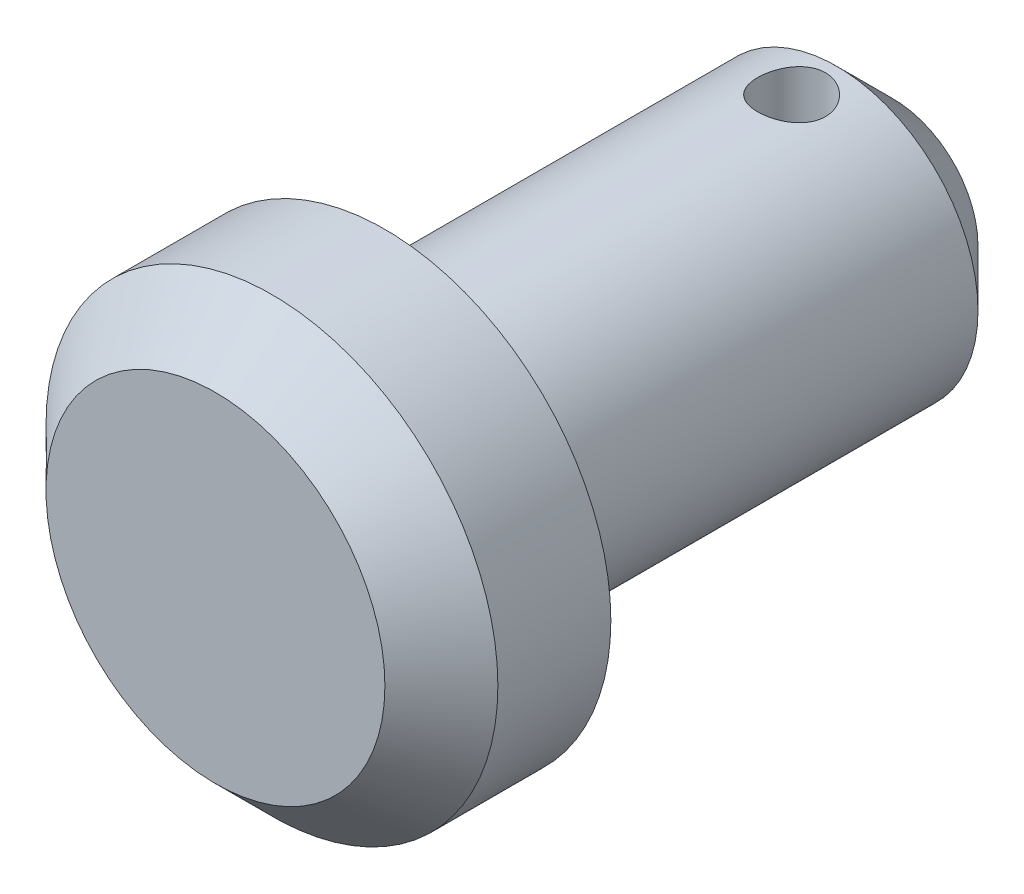
ISO-10303-21;
HEADER;
FILE_DESCRIPTION(('STEP AP214'),'2;1');
FILE_NAME('part.step','',(''),(''),'','','');
FILE_SCHEMA(('AUTOMOTIVE_DESIGN { 1 0 10303 214 1 1 1 1 }'));
ENDSEC;
DATA;
#1=APPLICATION_CONTEXT('core data for automotive mechanical design processes');
#2=APPLICATION_PROTOCOL_DEFINITION('international standard','automotive_design',2000,#1);
#3=PRODUCT_CONTEXT('',#1,'mechanical');
#4=PRODUCT('Part','Part','',(#3));
#5=PRODUCT_RELATED_PRODUCT_CATEGORY('part','',(#4));
#6=PRODUCT_DEFINITION_FORMATION('','',#4);
#7=PRODUCT_DEFINITION_CONTEXT('part definition',#1,'design');
#8=PRODUCT_DEFINITION('design','',#6,#7);
#9=PRODUCT_DEFINITION_SHAPE('','',#8);
#10=(LENGTH_UNIT() NAMED_UNIT(*) SI_UNIT(.MILLI.,.METRE.));
#11=(NAMED_UNIT(*) PLANE_ANGLE_UNIT() SI_UNIT($,.RADIAN.));
#12=(NAMED_UNIT(*) SI_UNIT($,.STERADIAN.) SOLID_ANGLE_UNIT());
#13=UNCERTAINTY_MEASURE_WITH_UNIT(LENGTH_MEASURE(1.E-05),#10,'distance_accuracy_value','');
#14=(GEOMETRIC_REPRESENTATION_CONTEXT(3) GLOBAL_UNCERTAINTY_ASSIGNED_CONTEXT((#13)) GLOBAL_UNIT_ASSIGNED_CONTEXT((#10,
#11,#12)) REPRESENTATION_CONTEXT('',''));
#15=CARTESIAN_POINT('',(0.,0.,0.));
#16=DIRECTION('',(0.,0.,1.));
#17=DIRECTION('',(1.,0.,0.));
#18=AXIS2_PLACEMENT_3D('',#15,#16,#17);
#19=CARTESIAN_POINT('',(0.,0.,0.));
#20=DIRECTION('',(0.,0.,-1.));
#21=DIRECTION('',(-1.,0.,0.));
#22=AXIS2_PLACEMENT_3D('',#19,#20,#21);
#23=PLANE('',#22);
#24=CARTESIAN_POINT('',(0.,0.,0.));
#25=DIRECTION('',(0.,0.,1.));
#26=DIRECTION('',(1.,0.,0.));
#27=AXIS2_PLACEMENT_3D('',#24,#25,#26);
#28=CIRCLE('',#27,30.);
#29=CARTESIAN_POINT('',(30.,0.,0.));
#30=VERTEX_POINT('',#29);
#31=EDGE_CURVE('E10',#30,#30,#28,.T.);
#32=ORIENTED_EDGE('',*,*,#31,.T.);
#33=EDGE_LOOP('',(#32));
#34=FACE_BOUND('',#33,.T.);
#35=ADVANCED_FACE('F37',(#34),#23,.F.);
#36=CARTESIAN_POINT('',(0.,0.,-9.99999999999996));
#37=DIRECTION('',(0.,0.,-1.));
#38=DIRECTION('',(-1.,0.,0.));
#39=AXIS2_PLACEMENT_3D('',#36,#37,#38);
#40=CONICAL_SURFACE('',#39,40.,0.78539816339745);
#41=ORIENTED_EDGE('',*,*,#31,.F.);
#42=EDGE_LOOP('',(#41));
#43=FACE_BOUND('',#42,.T.);
#44=CARTESIAN_POINT('',(0.,0.,-9.99999999999996));
#45=DIRECTION('',(0.,0.,1.));
#46=DIRECTION('',(1.,0.,0.));
#47=AXIS2_PLACEMENT_3D('',#44,#45,#46);
#48=CIRCLE('',#47,40.);
#49=CARTESIAN_POINT('',(40.,0.,-9.99999999999996));
#50=VERTEX_POINT('',#49);
#51=EDGE_CURVE('E50',#50,#50,#48,.T.);
#52=ORIENTED_EDGE('',*,*,#51,.T.);
#53=EDGE_LOOP('',(#52));
#54=FACE_BOUND('',#53,.T.);
#55=ADVANCED_FACE('F89',(#43,#54),#40,.T.);
#56=CARTESIAN_POINT('',(0.,0.,0.));
#57=DIRECTION('',(0.,0.,1.));
#58=DIRECTION('',(1.,0.,0.));
#59=AXIS2_PLACEMENT_3D('',#56,#57,#58);
#60=CYLINDRICAL_SURFACE('',#59,40.);
#61=ORIENTED_EDGE('',*,*,#51,.F.);
#62=EDGE_LOOP('',(#61));
#63=FACE_BOUND('',#62,.T.);
#64=CARTESIAN_POINT('',(0.,0.,-30.));
#65=DIRECTION('',(0.,0.,1.));
#66=DIRECTION('',(1.,0.,0.));
#67=AXIS2_PLACEMENT_3D('',#64,#65,#66);
#68=CIRCLE('',#67,40.);
#69=CARTESIAN_POINT('',(40.,0.,-30.));
#70=VERTEX_POINT('',#69);
#71=EDGE_CURVE('E56',#70,#70,#68,.T.);
#72=ORIENTED_EDGE('',*,*,#71,.T.);
#73=EDGE_LOOP('',(#72));
#74=FACE_BOUND('',#73,.T.);
#75=ADVANCED_FACE('F93',(#63,#74),#60,.T.);
#76=CARTESIAN_POINT('',(0.,40.,-30.));
#77=DIRECTION('',(0.,0.,1.));
#78=DIRECTION('',(1.,0.,0.));
#79=AXIS2_PLACEMENT_3D('',#76,#77,#78);
#80=PLANE('',#79);
#81=ORIENTED_EDGE('',*,*,#71,.F.);
#82=EDGE_LOOP('',(#81));
#83=FACE_BOUND('',#82,.T.);
#84=CARTESIAN_POINT('',(0.,0.,-30.));
#85=DIRECTION('',(0.,0.,1.));
#86=DIRECTION('',(1.,0.,0.));
#87=AXIS2_PLACEMENT_3D('',#84,#85,#86);
#88=CIRCLE('',#87,25.);
#89=CARTESIAN_POINT('',(25.,0.,-30.));
#90=VERTEX_POINT('',#89);
#91=EDGE_CURVE('E110',#90,#90,#88,.T.);
#92=ORIENTED_EDGE('',*,*,#91,.T.);
#93=EDGE_LOOP('',(#92));
#94=FACE_BOUND('',#93,.T.);
#95=ADVANCED_FACE('F84',(#83,#94),#80,.F.);
#96=CARTESIAN_POINT('',(0.,0.,0.));
#97=DIRECTION('',(0.,0.,1.));
#98=DIRECTION('',(1.,0.,0.));
#99=AXIS2_PLACEMENT_3D('',#96,#97,#98);
#100=CYLINDRICAL_SURFACE('',#99,25.);
#101=CARTESIAN_POINT('',(0.,-25.,-96.));
#102=CARTESIAN_POINT('',(0.166017736340744,-25.0000026804997,-95.9999954345979));
#103=CARTESIAN_POINT('',(0.331984064130571,-24.9983437383731,-96.0068916684901));
#104=CARTESIAN_POINT('',(0.662757375273784,-24.9917601768854,-96.0344090099474));
#105=CARTESIAN_POINT('',(0.827564209779563,-24.9868351457074,-96.0550318482831));
#106=CARTESIAN_POINT('',(1.15483168687375,-24.9738504635424,-96.1098464151674));
#107=CARTESIAN_POINT('',(1.31729147606247,-24.9657897007271,-96.144042956597));
#108=CARTESIAN_POINT('',(1.63872050759381,-24.9467537443302,-96.2257380792299));
#109=CARTESIAN_POINT('',(1.79768844089951,-24.9357774773038,-96.2732415602008));
#110=CARTESIAN_POINT('',(2.11072366381165,-24.9112316091515,-96.3810845999628));
#111=CARTESIAN_POINT('',(2.26479812859839,-24.897666030887,-96.4414042632373));
#112=CARTESIAN_POINT('',(2.56731972417305,-24.8682925860487,-96.5744873495995));
#113=CARTESIAN_POINT('',(2.71576475309531,-24.8524838922068,-96.6472553657249));
#114=CARTESIAN_POINT('',(3.00593509691774,-24.8190587739081,-96.8046570905517));
#115=CARTESIAN_POINT('',(3.14766294672407,-24.8014430394569,-96.8892862746391));
#116=CARTESIAN_POINT('',(3.42359889441686,-24.7648612187919,-97.069871239809));
#117=CARTESIAN_POINT('',(3.55780414185136,-24.7458946268123,-97.1658312721407));
#118=CARTESIAN_POINT('',(3.81996752921303,-24.7067947855154,-97.3701054995632));
#119=CARTESIAN_POINT('',(3.94778319107672,-24.6866473068088,-97.4785998623137));
#120=CARTESIAN_POINT('',(4.19391043753479,-24.6460277155742,-97.7059123541216));
#121=CARTESIAN_POINT('',(4.31221847908384,-24.6255554853983,-97.8247342977654));
#122=CARTESIAN_POINT('',(4.53846894982133,-24.5848634527513,-98.0718508641517));
#123=CARTESIAN_POINT('',(4.64641408237687,-24.5646435856504,-98.2001430008769));
#124=CARTESIAN_POINT('',(4.85128465634762,-24.5250062264423,-98.4654368671125));
#125=CARTESIAN_POINT('',(4.94820601608992,-24.5055890332168,-98.6024417935444));
#126=CARTESIAN_POINT('',(5.1315149308875,-24.4678652790419,-98.8860890587549));
#127=CARTESIAN_POINT('',(5.21774615640803,-24.4495768107614,-99.0328349214476));
#128=CARTESIAN_POINT('',(5.37754406139993,-24.4149279468241,-99.3333541827147));
#129=CARTESIAN_POINT('',(5.45110595933349,-24.3985682798489,-99.4871302069595));
#130=CARTESIAN_POINT('',(5.58492026214268,-24.3682865029779,-99.8005322339703));
#131=CARTESIAN_POINT('',(5.64517912327471,-24.354363211339,-99.9601553549607));
#132=CARTESIAN_POINT('',(5.75195806967359,-24.3293636773731,-100.284147125475));
#133=CARTESIAN_POINT('',(5.79847322039683,-24.318288457803,-100.448517456241));
#134=CARTESIAN_POINT('',(5.91523377010968,-24.2902598679583,-100.940800804161));
#135=CARTESIAN_POINT('',(5.96534620186163,-24.2778811042379,-101.274125250886));
#136=CARTESIAN_POINT('',(5.99819895021148,-24.2697663322526,-101.776475601756));
#137=CARTESIAN_POINT('',(6.00209048242323,-24.2688053008257,-101.944385487369));
#138=CARTESIAN_POINT('',(5.99581246294926,-24.2703574949624,-102.279946661259));
#139=CARTESIAN_POINT('',(5.98564275494965,-24.2728707591485,-102.447597946641));
#140=CARTESIAN_POINT('',(5.93483975630033,-24.285368999466,-102.940764562036));
#141=CARTESIAN_POINT('',(5.87440247397774,-24.3001939850224,-103.26433890737));
#142=CARTESIAN_POINT('',(5.70184242669472,-24.3412549446464,-103.896444859761));
#143=CARTESIAN_POINT('',(5.58971623816143,-24.3674916745551,-104.204975468911));
#144=CARTESIAN_POINT('',(5.31588253494411,-24.4286958367201,-104.801812311694));
#145=CARTESIAN_POINT('',(5.15371899452585,-24.4637429965247,-105.089901246387));
#146=CARTESIAN_POINT('',(4.78473374953622,-24.5385748778448,-105.635212661486));
#147=CARTESIAN_POINT('',(4.57790479882187,-24.5783603675971,-105.892430123017));
#148=CARTESIAN_POINT('',(4.11902988641843,-24.6594640880418,-106.375786122191));
#149=CARTESIAN_POINT('',(3.86594129003373,-24.7007951674045,-106.6009339253));
#150=CARTESIAN_POINT('',(3.32511184695824,-24.7793903091839,-107.005769712324));
#151=CARTESIAN_POINT('',(3.0373700989422,-24.8166542657671,-107.185456513426));
#152=CARTESIAN_POINT('',(2.43405695507432,-24.8830789940348,-107.494594368169));
#153=CARTESIAN_POINT('',(2.11840557448716,-24.9122154123614,-107.623894894268));
#154=CARTESIAN_POINT('',(1.46899521159138,-24.9589240940734,-107.827330176301));
#155=CARTESIAN_POINT('',(1.13523942521409,-24.9764983913503,-107.901474635033));
#156=CARTESIAN_POINT('',(0.467574800827581,-24.9978055089126,-107.99100412952));
#157=CARTESIAN_POINT('',(0.133856966575303,-25.0018564268946,-108.007739803127));
#158=CARTESIAN_POINT('',(-0.531608768658081,-24.9965614831509,-107.985666448096));
#159=CARTESIAN_POINT('',(-0.863356829944314,-24.9872167270307,-107.946862003436));
#160=CARTESIAN_POINT('',(-1.51084514007901,-24.9563832816127,-107.815926114576));
#161=CARTESIAN_POINT('',(-1.8267410839496,-24.9350603275565,-107.724522047641));
#162=CARTESIAN_POINT('',(-2.4387066749497,-24.8826669936479,-107.491803349796));
#163=CARTESIAN_POINT('',(-2.73477441187555,-24.8515956762951,-107.350483918359));
#164=CARTESIAN_POINT('',(-3.30412273668564,-24.7823820658762,-107.019267825048));
#165=CARTESIAN_POINT('',(-3.57694246966834,-24.7441307708391,-106.828602373031));
#166=CARTESIAN_POINT('',(-4.08719914724013,-24.6649871461435,-106.40508233449));
#167=CARTESIAN_POINT('',(-4.32463047973872,-24.6240943990595,-106.172221069265));
#168=CARTESIAN_POINT('',(-4.76284500809665,-24.5431489449983,-105.664732875858));
#169=CARTESIAN_POINT('',(-4.96268414096836,-24.5031358001301,-105.389284582089));
#170=CARTESIAN_POINT('',(-5.31333575577366,-24.4295058119813,-104.807764320409));
#171=CARTESIAN_POINT('',(-5.46415043292341,-24.395888682328,-104.501693724506));
#172=CARTESIAN_POINT('',(-5.64963439053452,-24.353347630646,-104.027406316014));
#173=CARTESIAN_POINT('',(-5.70458710242878,-24.3405033891164,-103.867193043385));
#174=CARTESIAN_POINT('',(-5.80079732294279,-24.3177552029261,-103.542517979968));
#175=CARTESIAN_POINT('',(-5.84205998439172,-24.3078501521252,-103.378057812857));
#176=CARTESIAN_POINT('',(-5.91053741786634,-24.2912903166139,-103.046082096771));
#177=CARTESIAN_POINT('',(-5.93775173433045,-24.2846356373073,-102.878566448895));
#178=CARTESIAN_POINT('',(-5.97789965204539,-24.2747841701866,-102.541733533145));
#179=CARTESIAN_POINT('',(-5.99083389159896,-24.2715872278157,-102.372416346139));
#180=CARTESIAN_POINT('',(-6.00215499594079,-24.2687899616173,-102.037751269488));
#181=CARTESIAN_POINT('',(-6.00091722515411,-24.2690968340135,-101.872416715526));
#182=CARTESIAN_POINT('',(-5.98480872784869,-24.2730742483489,-101.542456478065));
#183=CARTESIAN_POINT('',(-5.969938298505,-24.2767447169658,-101.377830779192));
#184=CARTESIAN_POINT('',(-5.92668661056588,-24.2873399112073,-101.050445398434));
#185=CARTESIAN_POINT('',(-5.89830323162515,-24.294265147542,-100.887686013502));
#186=CARTESIAN_POINT('',(-5.82827196779404,-24.3111608262961,-100.565269798519));
#187=CARTESIAN_POINT('',(-5.78662876790753,-24.3211301931022,-100.40561189375));
#188=CARTESIAN_POINT('',(-5.69063662986335,-24.3437686465433,-100.091192481029));
#189=CARTESIAN_POINT('',(-5.63634876916799,-24.3564247302984,-99.9364113728174));
#190=CARTESIAN_POINT('',(-5.51539707483436,-24.3840980883562,-99.6320466118608));
#191=CARTESIAN_POINT('',(-5.44873755154826,-24.3991145400161,-99.4824611704006));
#192=CARTESIAN_POINT('',(-5.30348427217981,-24.4310987091682,-99.1893378330844));
#193=CARTESIAN_POINT('',(-5.22488523075193,-24.4480672900111,-99.0458026516644));
#194=CARTESIAN_POINT('',(-5.05635243091258,-24.4834782828489,-98.7658088548311));
#195=CARTESIAN_POINT('',(-4.96642242689348,-24.5019202059306,-98.6293479164855));
#196=CARTESIAN_POINT('',(-4.77346921711415,-24.5402505889388,-98.3610496167077));
#197=CARTESIAN_POINT('',(-4.67017903544834,-24.5601634300574,-98.2294076688703));
#198=CARTESIAN_POINT('',(-4.45304880482869,-24.600458146359,-97.97529158151));
#199=CARTESIAN_POINT('',(-4.33921237965749,-24.6208398586377,-97.8528143188772));
#200=CARTESIAN_POINT('',(-4.10164015488732,-24.661530300392,-97.6177068870181));
#201=CARTESIAN_POINT('',(-3.97789855094998,-24.6818389796797,-97.5050825736226));
#202=CARTESIAN_POINT('',(-3.7214296777047,-24.7218081005976,-97.2905518952424));
#203=CARTESIAN_POINT('',(-3.58870570477298,-24.7414687761375,-97.1886416330669));
#204=CARTESIAN_POINT('',(-3.31280088827595,-24.7799327781137,-96.9945760775045));
#205=CARTESIAN_POINT('',(-3.16948213881107,-24.7987162302532,-96.9026127516375));
#206=CARTESIAN_POINT('',(-2.8754381763477,-24.8345280560803,-96.7311469277116));
#207=CARTESIAN_POINT('',(-2.72471571591034,-24.8515570748485,-96.6516398440273));
#208=CARTESIAN_POINT('',(-2.41692354679156,-24.883375777664,-96.5056877128525));
#209=CARTESIAN_POINT('',(-2.25985686316147,-24.8981665133663,-96.4392365266561));
#210=CARTESIAN_POINT('',(-1.94048744711081,-24.9250921884147,-96.3198957279609));
#211=CARTESIAN_POINT('',(-1.77818555787967,-24.9372275530119,-96.2670039437237));
#212=CARTESIAN_POINT('',(-1.35190448336008,-24.9647957983314,-96.1479748265459));
#213=CARTESIAN_POINT('',(-1.08469226075994,-24.9779181465939,-96.0925758515092));
#214=CARTESIAN_POINT('',(-0.544940331071901,-24.9955177731159,-96.0185933557941));
#215=CARTESIAN_POINT('',(-0.272400964328515,-24.9999956018512,-96.000007490886));
#216=CARTESIAN_POINT('',(0.,-25.,-96.));
#217=B_SPLINE_CURVE_WITH_KNOTS('',3,(#101,#102,#103,#104,#105,#106,#107,#108,#109,#110,#111,
#112,#113,#114,#115,#116,#117,#118,#119,#120,#121,#122,#123,#124,#125,#126,#127,#128,#129,#130,
#131,#132,#133,#134,#135,#136,#137,#138,#139,#140,#141,#142,#143,#144,#145,#146,#147,#148,#149,
#150,#151,#152,#153,#154,#155,#156,#157,#158,#159,#160,#161,#162,#163,#164,#165,#166,#167,#168,
#169,#170,#171,#172,#173,#174,#175,#176,#177,#178,#179,#180,#181,#182,#183,#184,#185,#186,#187,
#188,#189,#190,#191,#192,#193,#194,#195,#196,#197,#198,#199,#200,#201,#202,#203,#204,#205,#206,
#207,#208,#209,#210,#211,#212,#213,#214,#215,#216),.UNSPECIFIED.,.T.,.F.,(4,2,2,2,2,2,2,2,2,2,2,
2,2,2,2,2,2,2,2,2,2,2,2,2,2,2,2,2,2,2,2,2,2,2,2,2,2,2,2,2,2,2,2,2,2,2,2,2,2,2,2,2,2,2,2,2,2,4),
(0.,0.497813360100954,0.995689500769747,1.49374233325073,1.99197879609469,2.4894473877073,
2.98709992652942,3.4845631426913,3.98221359994715,4.48820831908742,4.99439073274951,
5.50044073797176,6.00667750796929,6.5196119014362,7.03273945954076,7.54561743540079,
8.05867933189508,9.06463756237654,9.56800871792682,10.0713854693234,11.0548629550302,
12.0384055899336,13.0311908061742,14.0241372047509,15.0430966233895,16.0620825507942,
17.0840897493149,18.1059171185591,19.1035329919673,20.1010665323702,21.085126203147,
22.069280539993,23.0698021185097,24.0704821968969,25.0936623603892,26.1167967016263,
26.6258643414059,27.1347401541084,27.6436324676663,28.1525020334114,28.6479253897995,
29.1433379468293,29.6388282657176,30.1341437102249,30.6271145113295,31.1199138801487,
31.6129320389054,32.105787268885,32.6107272666003,33.1154944014541,33.6205595212516,
34.1254402854413,34.6387770201077,35.1519243293048,35.6648297831432,36.1776530362049,
36.9945144051894,37.8113237554193),.UNSPECIFIED.);
#218=CARTESIAN_POINT('',(0.,-25.,-96.));
#219=VERTEX_POINT('',#218);
#220=EDGE_CURVE('E40',#219,#219,#217,.T.);
#221=ORIENTED_EDGE('',*,*,#220,.T.);
#222=EDGE_LOOP('',(#221));
#223=FACE_BOUND('',#222,.T.);
#224=CARTESIAN_POINT('',(0.,25.,-96.));
#225=CARTESIAN_POINT('',(-0.166017736340744,25.0000026804997,-95.9999954345979));
#226=CARTESIAN_POINT('',(-0.331984064130571,24.9983437383731,-96.0068916684901));
#227=CARTESIAN_POINT('',(-0.662757375273784,24.9917601768854,-96.0344090099474));
#228=CARTESIAN_POINT('',(-0.827564209779563,24.9868351457074,-96.0550318482831));
#229=CARTESIAN_POINT('',(-1.15483168687375,24.9738504635424,-96.1098464151674));
#230=CARTESIAN_POINT('',(-1.31729147606247,24.9657897007271,-96.144042956597));
#231=CARTESIAN_POINT('',(-1.63872050759381,24.9467537443302,-96.2257380792299));
#232=CARTESIAN_POINT('',(-1.79768844089951,24.9357774773038,-96.2732415602008));
#233=CARTESIAN_POINT('',(-2.11072366381165,24.9112316091515,-96.3810845999628));
#234=CARTESIAN_POINT('',(-2.26479812859839,24.897666030887,-96.4414042632373));
#235=CARTESIAN_POINT('',(-2.56731972417305,24.8682925860487,-96.5744873495995));
#236=CARTESIAN_POINT('',(-2.71576475309531,24.8524838922068,-96.6472553657249));
#237=CARTESIAN_POINT('',(-3.00593509691774,24.8190587739081,-96.8046570905517));
#238=CARTESIAN_POINT('',(-3.14766294672407,24.8014430394569,-96.8892862746391));
#239=CARTESIAN_POINT('',(-3.42359889441686,24.7648612187919,-97.069871239809));
#240=CARTESIAN_POINT('',(-3.55780414185136,24.7458946268123,-97.1658312721407));
#241=CARTESIAN_POINT('',(-3.81996752921303,24.7067947855154,-97.3701054995632));
#242=CARTESIAN_POINT('',(-3.94778319107672,24.6866473068088,-97.4785998623137));
#243=CARTESIAN_POINT('',(-4.19391043753479,24.6460277155742,-97.7059123541216));
#244=CARTESIAN_POINT('',(-4.31221847908384,24.6255554853983,-97.8247342977654));
#245=CARTESIAN_POINT('',(-4.53846894982133,24.5848634527513,-98.0718508641517));
#246=CARTESIAN_POINT('',(-4.64641408237687,24.5646435856504,-98.2001430008769));
#247=CARTESIAN_POINT('',(-4.85128465634762,24.5250062264423,-98.4654368671125));
#248=CARTESIAN_POINT('',(-4.94820601608992,24.5055890332168,-98.6024417935444));
#249=CARTESIAN_POINT('',(-5.1315149308875,24.4678652790419,-98.8860890587549));
#250=CARTESIAN_POINT('',(-5.21774615640803,24.4495768107614,-99.0328349214476));
#251=CARTESIAN_POINT('',(-5.37754406139993,24.4149279468241,-99.3333541827147));
#252=CARTESIAN_POINT('',(-5.45110595933349,24.3985682798489,-99.4871302069595));
#253=CARTESIAN_POINT('',(-5.58492026214268,24.3682865029779,-99.8005322339703));
#254=CARTESIAN_POINT('',(-5.64517912327471,24.354363211339,-99.9601553549607));
#255=CARTESIAN_POINT('',(-5.75195806967359,24.3293636773731,-100.284147125475));
#256=CARTESIAN_POINT('',(-5.79847322039683,24.318288457803,-100.448517456241));
#257=CARTESIAN_POINT('',(-5.91523377010968,24.2902598679583,-100.940800804161));
#258=CARTESIAN_POINT('',(-5.96534620186163,24.2778811042379,-101.274125250886));
#259=CARTESIAN_POINT('',(-5.99819895021148,24.2697663322526,-101.776475601756));
#260=CARTESIAN_POINT('',(-6.00209048242323,24.2688053008257,-101.944385487369));
#261=CARTESIAN_POINT('',(-5.99581246294926,24.2703574949624,-102.279946661259));
#262=CARTESIAN_POINT('',(-5.98564275494965,24.2728707591485,-102.447597946641));
#263=CARTESIAN_POINT('',(-5.93483975630033,24.285368999466,-102.940764562036));
#264=CARTESIAN_POINT('',(-5.87440247397774,24.3001939850224,-103.26433890737));
#265=CARTESIAN_POINT('',(-5.70184242669472,24.3412549446464,-103.896444859761));
#266=CARTESIAN_POINT('',(-5.58971623816143,24.3674916745551,-104.204975468911));
#267=CARTESIAN_POINT('',(-5.31588253494411,24.4286958367201,-104.801812311694));
#268=CARTESIAN_POINT('',(-5.15371899452585,24.4637429965247,-105.089901246387));
#269=CARTESIAN_POINT('',(-4.78473374953622,24.5385748778448,-105.635212661486));
#270=CARTESIAN_POINT('',(-4.57790479882187,24.5783603675971,-105.892430123017));
#271=CARTESIAN_POINT('',(-4.11902988641843,24.6594640880418,-106.375786122191));
#272=CARTESIAN_POINT('',(-3.86594129003373,24.7007951674045,-106.6009339253));
#273=CARTESIAN_POINT('',(-3.32511184695824,24.7793903091839,-107.005769712324));
#274=CARTESIAN_POINT('',(-3.0373700989422,24.8166542657671,-107.185456513426));
#275=CARTESIAN_POINT('',(-2.43405695507432,24.8830789940348,-107.494594368169));
#276=CARTESIAN_POINT('',(-2.11840557448716,24.9122154123614,-107.623894894268));
#277=CARTESIAN_POINT('',(-1.46899521159138,24.9589240940734,-107.827330176301));
#278=CARTESIAN_POINT('',(-1.13523942521409,24.9764983913503,-107.901474635033));
#279=CARTESIAN_POINT('',(-0.467574800827581,24.9978055089126,-107.99100412952));
#280=CARTESIAN_POINT('',(-0.133856966575303,25.0018564268946,-108.007739803127));
#281=CARTESIAN_POINT('',(0.531608768658081,24.9965614831509,-107.985666448096));
#282=CARTESIAN_POINT('',(0.863356829944314,24.9872167270307,-107.946862003436));
#283=CARTESIAN_POINT('',(1.51084514007901,24.9563832816127,-107.815926114576));
#284=CARTESIAN_POINT('',(1.8267410839496,24.9350603275565,-107.724522047641));
#285=CARTESIAN_POINT('',(2.4387066749497,24.8826669936479,-107.491803349796));
#286=CARTESIAN_POINT('',(2.73477441187555,24.8515956762951,-107.350483918359));
#287=CARTESIAN_POINT('',(3.30412273668564,24.7823820658762,-107.019267825048));
#288=CARTESIAN_POINT('',(3.57694246966834,24.7441307708391,-106.828602373031));
#289=CARTESIAN_POINT('',(4.08719914724013,24.6649871461435,-106.40508233449));
#290=CARTESIAN_POINT('',(4.32463047973872,24.6240943990595,-106.172221069265));
#291=CARTESIAN_POINT('',(4.76284500809665,24.5431489449983,-105.664732875858));
#292=CARTESIAN_POINT('',(4.96268414096836,24.5031358001301,-105.389284582089));
#293=CARTESIAN_POINT('',(5.31333575577366,24.4295058119813,-104.807764320409));
#294=CARTESIAN_POINT('',(5.46415043292341,24.395888682328,-104.501693724506));
#295=CARTESIAN_POINT('',(5.64963439053452,24.353347630646,-104.027406316014));
#296=CARTESIAN_POINT('',(5.70458710242878,24.3405033891164,-103.867193043385));
#297=CARTESIAN_POINT('',(5.80079732294279,24.3177552029261,-103.542517979968));
#298=CARTESIAN_POINT('',(5.84205998439172,24.3078501521252,-103.378057812857));
#299=CARTESIAN_POINT('',(5.91053741786634,24.2912903166139,-103.046082096771));
#300=CARTESIAN_POINT('',(5.93775173433045,24.2846356373073,-102.878566448895));
#301=CARTESIAN_POINT('',(5.97789965204539,24.2747841701866,-102.541733533145));
#302=CARTESIAN_POINT('',(5.99083389159896,24.2715872278157,-102.372416346139));
#303=CARTESIAN_POINT('',(6.00215499594079,24.2687899616173,-102.037751269488));
#304=CARTESIAN_POINT('',(6.00091722515411,24.2690968340135,-101.872416715526));
#305=CARTESIAN_POINT('',(5.98480872784869,24.2730742483489,-101.542456478065));
#306=CARTESIAN_POINT('',(5.969938298505,24.2767447169658,-101.377830779192));
#307=CARTESIAN_POINT('',(5.92668661056588,24.2873399112073,-101.050445398434));
#308=CARTESIAN_POINT('',(5.89830323162515,24.294265147542,-100.887686013502));
#309=CARTESIAN_POINT('',(5.82827196779404,24.3111608262961,-100.565269798519));
#310=CARTESIAN_POINT('',(5.78662876790753,24.3211301931022,-100.40561189375));
#311=CARTESIAN_POINT('',(5.69063662986335,24.3437686465433,-100.091192481029));
#312=CARTESIAN_POINT('',(5.63634876916799,24.3564247302984,-99.9364113728174));
#313=CARTESIAN_POINT('',(5.51539707483436,24.3840980883562,-99.6320466118608));
#314=CARTESIAN_POINT('',(5.44873755154826,24.3991145400161,-99.4824611704006));
#315=CARTESIAN_POINT('',(5.30348427217981,24.4310987091682,-99.1893378330844));
#316=CARTESIAN_POINT('',(5.22488523075193,24.4480672900111,-99.0458026516644));
#317=CARTESIAN_POINT('',(5.05635243091258,24.4834782828489,-98.7658088548311));
#318=CARTESIAN_POINT('',(4.96642242689348,24.5019202059306,-98.6293479164855));
#319=CARTESIAN_POINT('',(4.77346921711415,24.5402505889388,-98.3610496167077));
#320=CARTESIAN_POINT('',(4.67017903544834,24.5601634300574,-98.2294076688703));
#321=CARTESIAN_POINT('',(4.45304880482869,24.600458146359,-97.97529158151));
#322=CARTESIAN_POINT('',(4.33921237965749,24.6208398586377,-97.8528143188772));
#323=CARTESIAN_POINT('',(4.10164015488732,24.661530300392,-97.6177068870181));
#324=CARTESIAN_POINT('',(3.97789855094998,24.6818389796797,-97.5050825736226));
#325=CARTESIAN_POINT('',(3.7214296777047,24.7218081005976,-97.2905518952424));
#326=CARTESIAN_POINT('',(3.58870570477298,24.7414687761375,-97.1886416330669));
#327=CARTESIAN_POINT('',(3.31280088827595,24.7799327781137,-96.9945760775045));
#328=CARTESIAN_POINT('',(3.16948213881107,24.7987162302532,-96.9026127516375));
#329=CARTESIAN_POINT('',(2.8754381763477,24.8345280560803,-96.7311469277116));
#330=CARTESIAN_POINT('',(2.72471571591034,24.8515570748485,-96.6516398440273));
#331=CARTESIAN_POINT('',(2.41692354679156,24.883375777664,-96.5056877128525));
#332=CARTESIAN_POINT('',(2.25985686316147,24.8981665133663,-96.4392365266561));
#333=CARTESIAN_POINT('',(1.94048744711081,24.9250921884147,-96.3198957279609));
#334=CARTESIAN_POINT('',(1.77818555787967,24.9372275530119,-96.2670039437237));
#335=CARTESIAN_POINT('',(1.35190448336008,24.9647957983314,-96.1479748265459));
#336=CARTESIAN_POINT('',(1.08469226075994,24.9779181465939,-96.0925758515092));
#337=CARTESIAN_POINT('',(0.544940331071901,24.9955177731159,-96.0185933557941));
#338=CARTESIAN_POINT('',(0.272400964328515,24.9999956018512,-96.000007490886));
#339=CARTESIAN_POINT('',(0.,25.,-96.));
#340=B_SPLINE_CURVE_WITH_KNOTS('',3,(#224,#225,#226,#227,#228,#229,#230,#231,#232,#233,#234,
#235,#236,#237,#238,#239,#240,#241,#242,#243,#244,#245,#246,#247,#248,#249,#250,#251,#252,#253,
#254,#255,#256,#257,#258,#259,#260,#261,#262,#263,#264,#265,#266,#267,#268,#269,#270,#271,#272,
#273,#274,#275,#276,#277,#278,#279,#280,#281,#282,#283,#284,#285,#286,#287,#288,#289,#290,#291,
#292,#293,#294,#295,#296,#297,#298,#299,#300,#301,#302,#303,#304,#305,#306,#307,#308,#309,#310,
#311,#312,#313,#314,#315,#316,#317,#318,#319,#320,#321,#322,#323,#324,#325,#326,#327,#328,#329,
#330,#331,#332,#333,#334,#335,#336,#337,#338,#339),.UNSPECIFIED.,.T.,.F.,(4,2,2,2,2,2,2,2,2,2,2,
2,2,2,2,2,2,2,2,2,2,2,2,2,2,2,2,2,2,2,2,2,2,2,2,2,2,2,2,2,2,2,2,2,2,2,2,2,2,2,2,2,2,2,2,2,2,4),
(0.,0.497813360100954,0.995689500769747,1.49374233325073,1.99197879609469,2.4894473877073,
2.98709992652942,3.4845631426913,3.98221359994715,4.48820831908742,4.99439073274951,
5.50044073797176,6.00667750796929,6.5196119014362,7.03273945954076,7.54561743540079,
8.05867933189508,9.06463756237654,9.56800871792682,10.0713854693234,11.0548629550302,
12.0384055899336,13.0311908061742,14.0241372047509,15.0430966233895,16.0620825507942,
17.0840897493149,18.1059171185591,19.1035329919673,20.1010665323702,21.085126203147,
22.069280539993,23.0698021185097,24.0704821968969,25.0936623603892,26.1167967016263,
26.6258643414059,27.1347401541084,27.6436324676663,28.1525020334114,28.6479253897995,
29.1433379468293,29.6388282657176,30.1341437102249,30.6271145113295,31.1199138801487,
31.6129320389054,32.105787268885,32.6107272666003,33.1154944014541,33.6205595212516,
34.1254402854413,34.6387770201077,35.1519243293048,35.6648297831432,36.1776530362049,
36.9945144051894,37.8113237554193),.UNSPECIFIED.);
#341=CARTESIAN_POINT('',(0.,25.,-96.));
#342=VERTEX_POINT('',#341);
#343=EDGE_CURVE('E59',#342,#342,#340,.T.);
#344=ORIENTED_EDGE('',*,*,#343,.T.);
#345=EDGE_LOOP('',(#344));
#346=FACE_BOUND('',#345,.T.);
#347=ORIENTED_EDGE('',*,*,#91,.F.);
#348=EDGE_LOOP('',(#347));
#349=FACE_BOUND('',#348,.T.);
#350=CARTESIAN_POINT('',(0.,0.,-110.));
#351=DIRECTION('',(0.,0.,1.));
#352=DIRECTION('',(1.,0.,0.));
#353=AXIS2_PLACEMENT_3D('',#350,#351,#352);
#354=CIRCLE('',#353,25.);
#355=CARTESIAN_POINT('',(25.,0.,-110.));
#356=VERTEX_POINT('',#355);
#357=EDGE_CURVE('E113',#356,#356,#354,.T.);
#358=ORIENTED_EDGE('',*,*,#357,.T.);
#359=EDGE_LOOP('',(#358));
#360=FACE_BOUND('',#359,.T.);
#361=ADVANCED_FACE('F65',(#223,#346,#349,#360),#100,.T.);
#362=CARTESIAN_POINT('',(0.,0.,-120.));
#363=DIRECTION('',(0.,0.,1.));
#364=DIRECTION('',(1.,0.,0.));
#365=AXIS2_PLACEMENT_3D('',#362,#363,#364);
#366=CONICAL_SURFACE('',#365,15.,0.785398163397446);
#367=ORIENTED_EDGE('',*,*,#357,.F.);
#368=EDGE_LOOP('',(#367));
#369=FACE_BOUND('',#368,.T.);
#370=CARTESIAN_POINT('',(0.,0.,-120.));
#371=DIRECTION('',(0.,0.,1.));
#372=DIRECTION('',(1.,0.,0.));
#373=AXIS2_PLACEMENT_3D('',#370,#371,#372);
#374=CIRCLE('',#373,15.);
#375=CARTESIAN_POINT('',(15.,0.,-120.));
#376=VERTEX_POINT('',#375);
#377=EDGE_CURVE('E118',#376,#376,#374,.T.);
#378=ORIENTED_EDGE('',*,*,#377,.T.);
#379=EDGE_LOOP('',(#378));
#380=FACE_BOUND('',#379,.T.);
#381=ADVANCED_FACE('F77',(#369,#380),#366,.T.);
#382=CARTESIAN_POINT('',(0.,0.,-120.));
#383=DIRECTION('',(0.,0.,1.));
#384=DIRECTION('',(1.,0.,0.));
#385=AXIS2_PLACEMENT_3D('',#382,#383,#384);
#386=PLANE('',#385);
#387=ORIENTED_EDGE('',*,*,#377,.F.);
#388=EDGE_LOOP('',(#387));
#389=FACE_BOUND('',#388,.T.);
#390=ADVANCED_FACE('F73',(#389),#386,.F.);
#391=CARTESIAN_POINT('',(0.,-40.,-102.));
#392=DIRECTION('',(0.,1.,0.));
#393=DIRECTION('',(0.,0.,1.));
#394=AXIS2_PLACEMENT_3D('',#391,#392,#393);
#395=CYLINDRICAL_SURFACE('',#394,6.);
#396=ORIENTED_EDGE('',*,*,#343,.F.);
#397=EDGE_LOOP('',(#396));
#398=FACE_BOUND('',#397,.T.);
#399=ORIENTED_EDGE('',*,*,#220,.F.);
#400=EDGE_LOOP('',(#399));
#401=FACE_BOUND('',#400,.T.);
#402=ADVANCED_FACE('F69',(#398,#401),#395,.F.);
#403=CLOSED_SHELL('',(#35,#55,#75,#95,#361,#381,#390,#402));
#404=MANIFOLD_SOLID_BREP('B2',#403);
#405=ADVANCED_BREP_SHAPE_REPRESENTATION('',(#18,#404),#14);
#406=SHAPE_DEFINITION_REPRESENTATION(#9,#405);
ENDSEC;
END-ISO-10303-21;
